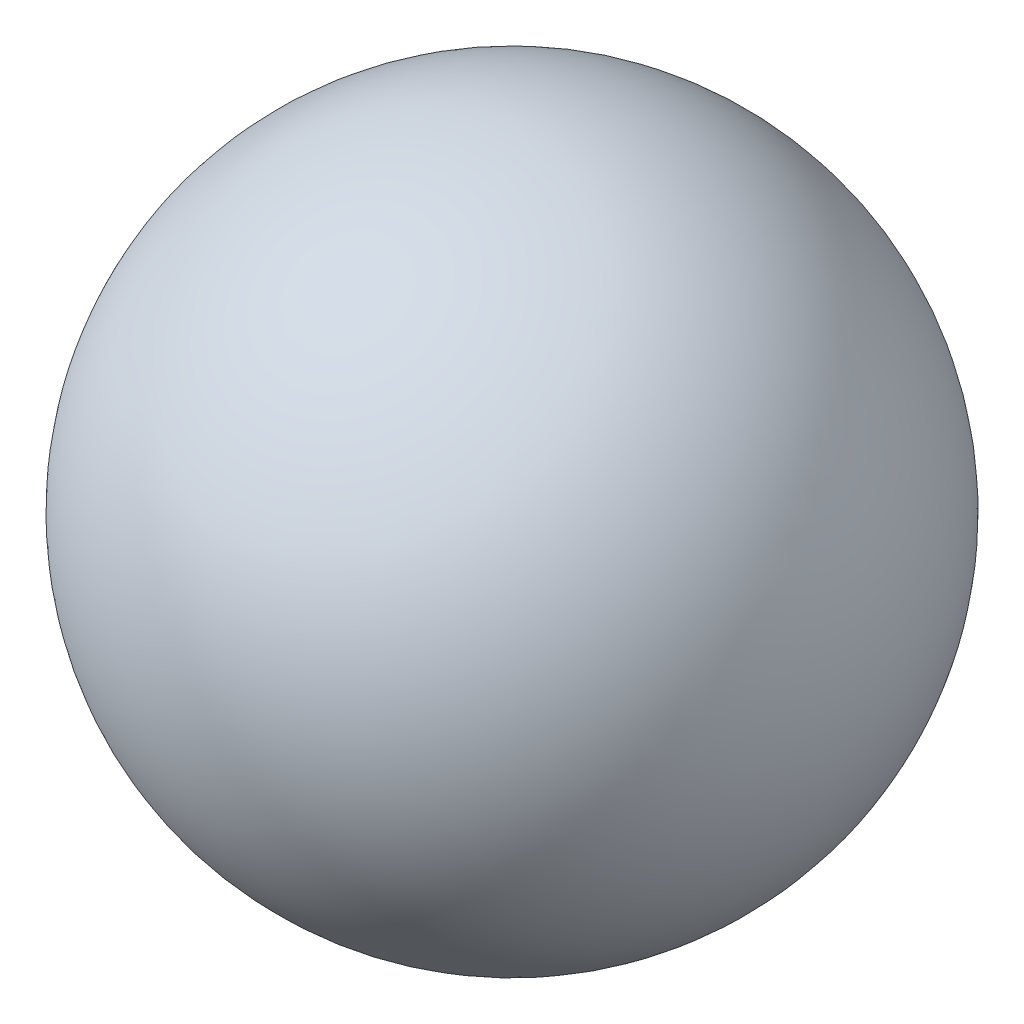
ISO-10303-21;
HEADER;
FILE_DESCRIPTION(('STEP AP214'),'2;1');
FILE_NAME('part.step','',(''),(''),'','','');
FILE_SCHEMA(('AUTOMOTIVE_DESIGN { 1 0 10303 214 1 1 1 1 }'));
ENDSEC;
DATA;
#1=APPLICATION_CONTEXT('core data for automotive mechanical design processes');
#2=APPLICATION_PROTOCOL_DEFINITION('international standard','automotive_design',2000,#1);
#3=PRODUCT_CONTEXT('',#1,'mechanical');
#4=PRODUCT('Part','Part','',(#3));
#5=PRODUCT_RELATED_PRODUCT_CATEGORY('part','',(#4));
#6=PRODUCT_DEFINITION_FORMATION('','',#4);
#7=PRODUCT_DEFINITION_CONTEXT('part definition',#1,'design');
#8=PRODUCT_DEFINITION('design','',#6,#7);
#9=PRODUCT_DEFINITION_SHAPE('','',#8);
#10=(LENGTH_UNIT() NAMED_UNIT(*) SI_UNIT(.MILLI.,.METRE.));
#11=(NAMED_UNIT(*) PLANE_ANGLE_UNIT() SI_UNIT($,.RADIAN.));
#12=(NAMED_UNIT(*) SI_UNIT($,.STERADIAN.) SOLID_ANGLE_UNIT());
#13=UNCERTAINTY_MEASURE_WITH_UNIT(LENGTH_MEASURE(1.E-05),#10,'distance_accuracy_value','');
#14=(GEOMETRIC_REPRESENTATION_CONTEXT(3) GLOBAL_UNCERTAINTY_ASSIGNED_CONTEXT((#13)) GLOBAL_UNIT_ASSIGNED_CONTEXT((#10,
#11,#12)) REPRESENTATION_CONTEXT('',''));
#15=CARTESIAN_POINT('',(0.,0.,0.));
#16=DIRECTION('',(0.,0.,1.));
#17=DIRECTION('',(1.,0.,0.));
#18=AXIS2_PLACEMENT_3D('',#15,#16,#17);
#19=CARTESIAN_POINT('',(100.,850.,-100.));
#20=DIRECTION('',(-1.,0.,0.));
#21=DIRECTION('',(0.,0.,-1.));
#22=AXIS2_PLACEMENT_3D('',#19,#20,#21);
#23=SPHERICAL_SURFACE('',#22,1813.);
#24=CARTESIAN_POINT('',(-1713.,850.,-100.));
#25=VERTEX_POINT('',#24);
#26=VERTEX_LOOP('',#25);
#27=FACE_BOUND('',#26,.T.);
#28=ADVANCED_FACE('F49',(#27),#23,.T.);
#29=CLOSED_SHELL('',(#28));
#30=MANIFOLD_SOLID_BREP('B2',#29);
#31=CARTESIAN_POINT('',(0.,850.,0.));
#32=DIRECTION('',(1.,0.,0.));
#33=DIRECTION('',(0.,0.,-1.));
#34=AXIS2_PLACEMENT_3D('',#31,#32,#33);
#35=PLANE('',#34);
#36=DIRECTION('',(0.,0.,1.));
#37=VECTOR('',#36,1.);
#38=CARTESIAN_POINT('',(0.,0.,0.));
#39=LINE('',#38,#37);
#40=CARTESIAN_POINT('',(0.,0.,-200.));
#41=VERTEX_POINT('',#40);
#42=CARTESIAN_POINT('',(0.,0.,0.));
#43=VERTEX_POINT('',#42);
#44=EDGE_CURVE('E126',#41,#43,#39,.T.);
#45=ORIENTED_EDGE('',*,*,#44,.T.);
#46=DIRECTION('',(0.,-1.,0.));
#47=VECTOR('',#46,1.);
#48=CARTESIAN_POINT('',(0.,850.,0.));
#49=LINE('',#48,#47);
#50=CARTESIAN_POINT('',(0.,850.,0.));
#51=VERTEX_POINT('',#50);
#52=EDGE_CURVE('E47',#51,#43,#49,.T.);
#53=ORIENTED_EDGE('',*,*,#52,.F.);
#54=DIRECTION('',(0.,0.,1.));
#55=VECTOR('',#54,1.);
#56=CARTESIAN_POINT('',(0.,850.,0.));
#57=LINE('',#56,#55);
#58=CARTESIAN_POINT('',(0.,850.,-200.));
#59=VERTEX_POINT('',#58);
#60=EDGE_CURVE('E114',#59,#51,#57,.T.);
#61=ORIENTED_EDGE('',*,*,#60,.F.);
#62=DIRECTION('',(0.,-1.,0.));
#63=VECTOR('',#62,1.);
#64=CARTESIAN_POINT('',(0.,850.,-200.));
#65=LINE('',#64,#63);
#66=EDGE_CURVE('E122',#59,#41,#65,.T.);
#67=ORIENTED_EDGE('',*,*,#66,.T.);
#68=EDGE_LOOP('',(#45,#53,#61,#67));
#69=FACE_BOUND('',#68,.T.);
#70=ADVANCED_FACE('F63',(#69),#35,.F.);
#71=CARTESIAN_POINT('',(0.,850.,0.));
#72=DIRECTION('',(0.,0.,-1.));
#73=DIRECTION('',(-1.,0.,0.));
#74=AXIS2_PLACEMENT_3D('',#71,#72,#73);
#75=PLANE('',#74);
#76=DIRECTION('',(1.,0.,0.));
#77=VECTOR('',#76,1.);
#78=CARTESIAN_POINT('',(0.,0.,0.));
#79=LINE('',#78,#77);
#80=CARTESIAN_POINT('',(200.,0.,0.));
#81=VERTEX_POINT('',#80);
#82=EDGE_CURVE('E118',#43,#81,#79,.T.);
#83=ORIENTED_EDGE('',*,*,#82,.T.);
#84=DIRECTION('',(0.,-1.,0.));
#85=VECTOR('',#84,1.);
#86=CARTESIAN_POINT('',(200.,850.,0.));
#87=LINE('',#86,#85);
#88=CARTESIAN_POINT('',(200.,850.,0.));
#89=VERTEX_POINT('',#88);
#90=EDGE_CURVE('E71',#89,#81,#87,.T.);
#91=ORIENTED_EDGE('',*,*,#90,.F.);
#92=DIRECTION('',(1.,0.,0.));
#93=VECTOR('',#92,1.);
#94=CARTESIAN_POINT('',(0.,850.,0.));
#95=LINE('',#94,#93);
#96=EDGE_CURVE('E109',#51,#89,#95,.T.);
#97=ORIENTED_EDGE('',*,*,#96,.F.);
#98=ORIENTED_EDGE('',*,*,#52,.T.);
#99=EDGE_LOOP('',(#83,#91,#97,#98));
#100=FACE_BOUND('',#99,.T.);
#101=ADVANCED_FACE('F117',(#100),#75,.F.);
#102=CARTESIAN_POINT('',(200.,850.,0.));
#103=DIRECTION('',(-1.,0.,0.));
#104=DIRECTION('',(0.,0.,1.));
#105=AXIS2_PLACEMENT_3D('',#102,#103,#104);
#106=PLANE('',#105);
#107=DIRECTION('',(0.,0.,-1.));
#108=VECTOR('',#107,1.);
#109=CARTESIAN_POINT('',(200.,0.,0.));
#110=LINE('',#109,#108);
#111=CARTESIAN_POINT('',(200.,0.,-200.));
#112=VERTEX_POINT('',#111);
#113=EDGE_CURVE('E96',#81,#112,#110,.T.);
#114=ORIENTED_EDGE('',*,*,#113,.T.);
#115=DIRECTION('',(0.,-1.,0.));
#116=VECTOR('',#115,1.);
#117=CARTESIAN_POINT('',(200.,850.,-200.));
#118=LINE('',#117,#116);
#119=CARTESIAN_POINT('',(200.,850.,-200.));
#120=VERTEX_POINT('',#119);
#121=EDGE_CURVE('E119',#120,#112,#118,.T.);
#122=ORIENTED_EDGE('',*,*,#121,.F.);
#123=DIRECTION('',(0.,0.,-1.));
#124=VECTOR('',#123,1.);
#125=CARTESIAN_POINT('',(200.,850.,0.));
#126=LINE('',#125,#124);
#127=EDGE_CURVE('E112',#89,#120,#126,.T.);
#128=ORIENTED_EDGE('',*,*,#127,.F.);
#129=ORIENTED_EDGE('',*,*,#90,.T.);
#130=EDGE_LOOP('',(#114,#122,#128,#129));
#131=FACE_BOUND('',#130,.T.);
#132=ADVANCED_FACE('F120',(#131),#106,.F.);
#133=CARTESIAN_POINT('',(0.,850.,-200.));
#134=DIRECTION('',(0.,0.,1.));
#135=DIRECTION('',(1.,0.,0.));
#136=AXIS2_PLACEMENT_3D('',#133,#134,#135);
#137=PLANE('',#136);
#138=DIRECTION('',(-1.,0.,0.));
#139=VECTOR('',#138,1.);
#140=CARTESIAN_POINT('',(0.,0.,-200.));
#141=LINE('',#140,#139);
#142=EDGE_CURVE('E102',#112,#41,#141,.T.);
#143=ORIENTED_EDGE('',*,*,#142,.T.);
#144=ORIENTED_EDGE('',*,*,#66,.F.);
#145=DIRECTION('',(-1.,0.,0.));
#146=VECTOR('',#145,1.);
#147=CARTESIAN_POINT('',(0.,850.,-200.));
#148=LINE('',#147,#146);
#149=EDGE_CURVE('E79',#120,#59,#148,.T.);
#150=ORIENTED_EDGE('',*,*,#149,.F.);
#151=ORIENTED_EDGE('',*,*,#121,.T.);
#152=EDGE_LOOP('',(#143,#144,#150,#151));
#153=FACE_BOUND('',#152,.T.);
#154=ADVANCED_FACE('F134',(#153),#137,.F.);
#155=CARTESIAN_POINT('',(0.,850.,0.));
#156=DIRECTION('',(0.,-1.,0.));
#157=DIRECTION('',(0.,0.,-1.));
#158=AXIS2_PLACEMENT_3D('',#155,#156,#157);
#159=PLANE('',#158);
#160=CARTESIAN_POINT('',(100.,850.,-161.5));
#161=DIRECTION('',(0.,1.,0.));
#162=DIRECTION('',(0.,0.,1.));
#163=AXIS2_PLACEMENT_3D('',#160,#161,#162);
#164=CIRCLE('',#163,3.00000000000002);
#165=CARTESIAN_POINT('',(100.,850.,-158.5));
#166=VERTEX_POINT('',#165);
#167=EDGE_CURVE('E158',#166,#166,#164,.T.);
#168=ORIENTED_EDGE('',*,*,#167,.F.);
#169=EDGE_LOOP('',(#168));
#170=FACE_BOUND('',#169,.T.);
#171=CARTESIAN_POINT('',(161.5,850.,-100.));
#172=DIRECTION('',(0.,1.,0.));
#173=DIRECTION('',(0.,0.,1.));
#174=AXIS2_PLACEMENT_3D('',#171,#172,#173);
#175=CIRCLE('',#174,2.99999999999999);
#176=CARTESIAN_POINT('',(161.5,850.,-97.));
#177=VERTEX_POINT('',#176);
#178=EDGE_CURVE('E155',#177,#177,#175,.T.);
#179=ORIENTED_EDGE('',*,*,#178,.F.);
#180=EDGE_LOOP('',(#179));
#181=FACE_BOUND('',#180,.T.);
#182=CARTESIAN_POINT('',(100.,850.,-38.5));
#183=DIRECTION('',(0.,1.,0.));
#184=DIRECTION('',(0.,0.,1.));
#185=AXIS2_PLACEMENT_3D('',#182,#183,#184);
#186=CIRCLE('',#185,2.99999999999999);
#187=CARTESIAN_POINT('',(100.,850.,-35.5));
#188=VERTEX_POINT('',#187);
#189=EDGE_CURVE('E149',#188,#188,#186,.T.);
#190=ORIENTED_EDGE('',*,*,#189,.F.);
#191=EDGE_LOOP('',(#190));
#192=FACE_BOUND('',#191,.T.);
#193=CARTESIAN_POINT('',(38.5,850.,-100.));
#194=DIRECTION('',(0.,1.,0.));
#195=DIRECTION('',(0.,0.,1.));
#196=AXIS2_PLACEMENT_3D('',#193,#194,#195);
#197=CIRCLE('',#196,2.99999999999999);
#198=CARTESIAN_POINT('',(38.5,850.,-97.));
#199=VERTEX_POINT('',#198);
#200=EDGE_CURVE('E143',#199,#199,#197,.T.);
#201=ORIENTED_EDGE('',*,*,#200,.F.);
#202=EDGE_LOOP('',(#201));
#203=FACE_BOUND('',#202,.T.);
#204=ORIENTED_EDGE('',*,*,#60,.T.);
#205=ORIENTED_EDGE('',*,*,#96,.T.);
#206=ORIENTED_EDGE('',*,*,#127,.T.);
#207=ORIENTED_EDGE('',*,*,#149,.T.);
#208=EDGE_LOOP('',(#204,#205,#206,#207));
#209=FACE_BOUND('',#208,.T.);
#210=ADVANCED_FACE('F110',(#170,#181,#192,#203,#209),#159,.F.);
#211=CARTESIAN_POINT('',(0.,0.,0.));
#212=DIRECTION('',(0.,-1.,0.));
#213=DIRECTION('',(0.,0.,-1.));
#214=AXIS2_PLACEMENT_3D('',#211,#212,#213);
#215=PLANE('',#214);
#216=ORIENTED_EDGE('',*,*,#44,.F.);
#217=ORIENTED_EDGE('',*,*,#142,.F.);
#218=ORIENTED_EDGE('',*,*,#113,.F.);
#219=ORIENTED_EDGE('',*,*,#82,.F.);
#220=EDGE_LOOP('',(#216,#217,#218,#219));
#221=FACE_BOUND('',#220,.T.);
#222=ADVANCED_FACE('F137',(#221),#215,.T.);
#223=CARTESIAN_POINT('',(38.5,840.,-100.));
#224=DIRECTION('',(0.,1.,0.));
#225=DIRECTION('',(0.,0.,1.));
#226=AXIS2_PLACEMENT_3D('',#223,#224,#225);
#227=CYLINDRICAL_SURFACE('',#226,2.99999999999999);
#228=CARTESIAN_POINT('',(38.5,840.,-100.));
#229=DIRECTION('',(0.,1.,0.));
#230=DIRECTION('',(0.,0.,1.));
#231=AXIS2_PLACEMENT_3D('',#228,#229,#230);
#232=CIRCLE('',#231,2.99999999999999);
#233=CARTESIAN_POINT('',(38.5,840.,-97.));
#234=VERTEX_POINT('',#233);
#235=EDGE_CURVE('E140',#234,#234,#232,.T.);
#236=ORIENTED_EDGE('',*,*,#235,.F.);
#237=EDGE_LOOP('',(#236));
#238=FACE_BOUND('',#237,.T.);
#239=ORIENTED_EDGE('',*,*,#200,.T.);
#240=EDGE_LOOP('',(#239));
#241=FACE_BOUND('',#240,.T.);
#242=ADVANCED_FACE('F182',(#238,#241),#227,.F.);
#243=CARTESIAN_POINT('',(38.5,840.,-100.));
#244=DIRECTION('',(0.,1.,0.));
#245=DIRECTION('',(0.,0.,1.));
#246=AXIS2_PLACEMENT_3D('',#243,#244,#245);
#247=PLANE('',#246);
#248=ORIENTED_EDGE('',*,*,#235,.T.);
#249=EDGE_LOOP('',(#248));
#250=FACE_BOUND('',#249,.T.);
#251=ADVANCED_FACE('F184',(#250),#247,.T.);
#252=CARTESIAN_POINT('',(100.,840.,-38.5));
#253=DIRECTION('',(0.,1.,0.));
#254=DIRECTION('',(0.,0.,1.));
#255=AXIS2_PLACEMENT_3D('',#252,#253,#254);
#256=CYLINDRICAL_SURFACE('',#255,2.99999999999999);
#257=CARTESIAN_POINT('',(100.,840.,-38.5));
#258=DIRECTION('',(0.,1.,0.));
#259=DIRECTION('',(0.,0.,1.));
#260=AXIS2_PLACEMENT_3D('',#257,#258,#259);
#261=CIRCLE('',#260,2.99999999999999);
#262=CARTESIAN_POINT('',(100.,840.,-35.5));
#263=VERTEX_POINT('',#262);
#264=EDGE_CURVE('E146',#263,#263,#261,.T.);
#265=ORIENTED_EDGE('',*,*,#264,.F.);
#266=EDGE_LOOP('',(#265));
#267=FACE_BOUND('',#266,.T.);
#268=ORIENTED_EDGE('',*,*,#189,.T.);
#269=EDGE_LOOP('',(#268));
#270=FACE_BOUND('',#269,.T.);
#271=ADVANCED_FACE('F191',(#267,#270),#256,.F.);
#272=CARTESIAN_POINT('',(100.,840.,-38.5));
#273=DIRECTION('',(0.,1.,0.));
#274=DIRECTION('',(0.,0.,1.));
#275=AXIS2_PLACEMENT_3D('',#272,#273,#274);
#276=PLANE('',#275);
#277=ORIENTED_EDGE('',*,*,#264,.T.);
#278=EDGE_LOOP('',(#277));
#279=FACE_BOUND('',#278,.T.);
#280=ADVANCED_FACE('F248',(#279),#276,.T.);
#281=CARTESIAN_POINT('',(161.5,840.,-100.));
#282=DIRECTION('',(0.,1.,0.));
#283=DIRECTION('',(0.,0.,1.));
#284=AXIS2_PLACEMENT_3D('',#281,#282,#283);
#285=CYLINDRICAL_SURFACE('',#284,2.99999999999999);
#286=CARTESIAN_POINT('',(161.5,840.,-100.));
#287=DIRECTION('',(0.,1.,0.));
#288=DIRECTION('',(0.,0.,1.));
#289=AXIS2_PLACEMENT_3D('',#286,#287,#288);
#290=CIRCLE('',#289,2.99999999999999);
#291=CARTESIAN_POINT('',(161.5,840.,-97.));
#292=VERTEX_POINT('',#291);
#293=EDGE_CURVE('E152',#292,#292,#290,.T.);
#294=ORIENTED_EDGE('',*,*,#293,.F.);
#295=EDGE_LOOP('',(#294));
#296=FACE_BOUND('',#295,.T.);
#297=ORIENTED_EDGE('',*,*,#178,.T.);
#298=EDGE_LOOP('',(#297));
#299=FACE_BOUND('',#298,.T.);
#300=ADVANCED_FACE('F259',(#296,#299),#285,.F.);
#301=CARTESIAN_POINT('',(161.5,840.,-100.));
#302=DIRECTION('',(0.,1.,0.));
#303=DIRECTION('',(0.,0.,1.));
#304=AXIS2_PLACEMENT_3D('',#301,#302,#303);
#305=PLANE('',#304);
#306=ORIENTED_EDGE('',*,*,#293,.T.);
#307=EDGE_LOOP('',(#306));
#308=FACE_BOUND('',#307,.T.);
#309=ADVANCED_FACE('F169',(#308),#305,.T.);
#310=CARTESIAN_POINT('',(100.,840.,-161.5));
#311=DIRECTION('',(0.,1.,0.));
#312=DIRECTION('',(0.,0.,1.));
#313=AXIS2_PLACEMENT_3D('',#310,#311,#312);
#314=CYLINDRICAL_SURFACE('',#313,3.00000000000002);
#315=CARTESIAN_POINT('',(100.,840.,-161.5));
#316=DIRECTION('',(0.,1.,0.));
#317=DIRECTION('',(0.,0.,1.));
#318=AXIS2_PLACEMENT_3D('',#315,#316,#317);
#319=CIRCLE('',#318,3.00000000000002);
#320=CARTESIAN_POINT('',(100.,840.,-158.5));
#321=VERTEX_POINT('',#320);
#322=EDGE_CURVE('E129',#321,#321,#319,.T.);
#323=ORIENTED_EDGE('',*,*,#322,.F.);
#324=EDGE_LOOP('',(#323));
#325=FACE_BOUND('',#324,.T.);
#326=ORIENTED_EDGE('',*,*,#167,.T.);
#327=EDGE_LOOP('',(#326));
#328=FACE_BOUND('',#327,.T.);
#329=ADVANCED_FACE('F166',(#325,#328),#314,.F.);
#330=CARTESIAN_POINT('',(100.,840.,-161.5));
#331=DIRECTION('',(0.,1.,0.));
#332=DIRECTION('',(0.,0.,1.));
#333=AXIS2_PLACEMENT_3D('',#330,#331,#332);
#334=PLANE('',#333);
#335=ORIENTED_EDGE('',*,*,#322,.T.);
#336=EDGE_LOOP('',(#335));
#337=FACE_BOUND('',#336,.T.);
#338=ADVANCED_FACE('F164',(#337),#334,.T.);
#339=CLOSED_SHELL('',(#70,#101,#132,#154,#210,#222,#242,#251,#271,#280,#300,#309,#329,#338));
#340=MANIFOLD_SOLID_BREP('B6',#339);
#341=ADVANCED_BREP_SHAPE_REPRESENTATION('',(#18,#30,#340),#14);
#342=SHAPE_DEFINITION_REPRESENTATION(#9,#341);
ENDSEC;
END-ISO-10303-21;
